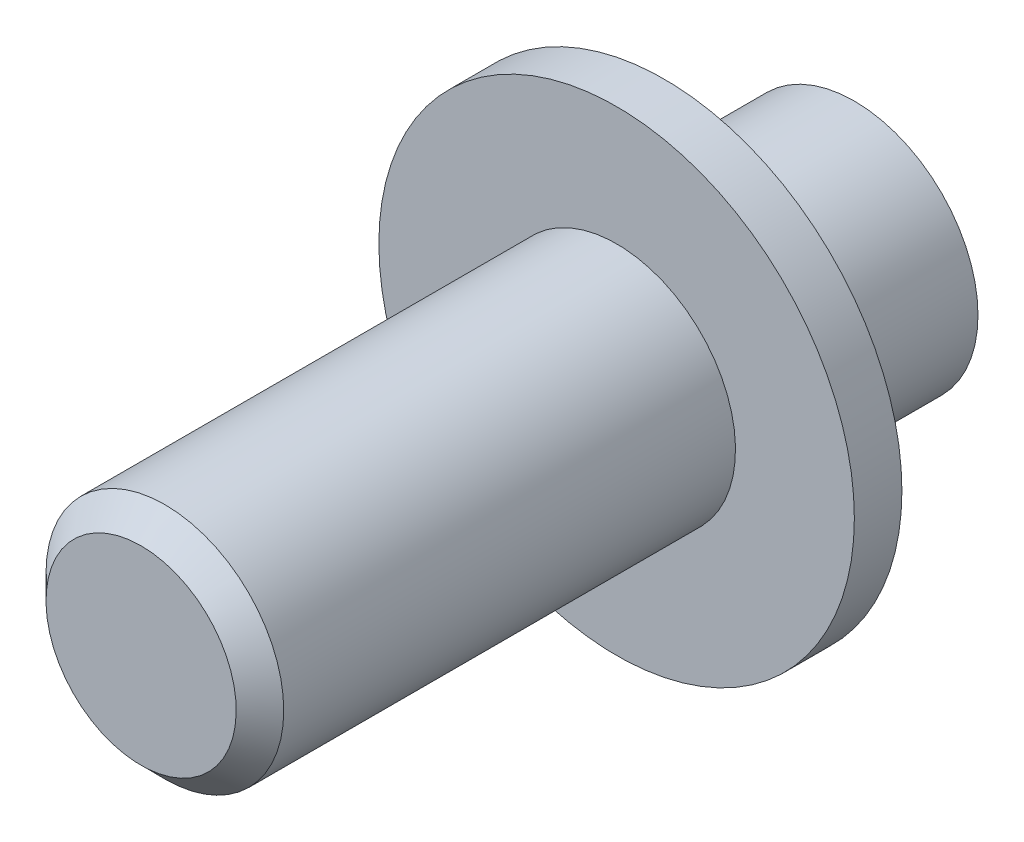
ISO-10303-21;
HEADER;
FILE_DESCRIPTION(('STEP AP214'),'2;1');
FILE_NAME('part.step','',(''),(''),'','','');
FILE_SCHEMA(('AUTOMOTIVE_DESIGN { 1 0 10303 214 1 1 1 1 }'));
ENDSEC;
DATA;
#1=APPLICATION_CONTEXT('core data for automotive mechanical design processes');
#2=APPLICATION_PROTOCOL_DEFINITION('international standard','automotive_design',2000,#1);
#3=PRODUCT_CONTEXT('',#1,'mechanical');
#4=PRODUCT('Part','Part','',(#3));
#5=PRODUCT_RELATED_PRODUCT_CATEGORY('part','',(#4));
#6=PRODUCT_DEFINITION_FORMATION('','',#4);
#7=PRODUCT_DEFINITION_CONTEXT('part definition',#1,'design');
#8=PRODUCT_DEFINITION('design','',#6,#7);
#9=PRODUCT_DEFINITION_SHAPE('','',#8);
#10=(LENGTH_UNIT() NAMED_UNIT(*) SI_UNIT(.MILLI.,.METRE.));
#11=(NAMED_UNIT(*) PLANE_ANGLE_UNIT() SI_UNIT($,.RADIAN.));
#12=(NAMED_UNIT(*) SI_UNIT($,.STERADIAN.) SOLID_ANGLE_UNIT());
#13=UNCERTAINTY_MEASURE_WITH_UNIT(LENGTH_MEASURE(1.E-05),#10,'distance_accuracy_value','');
#14=(GEOMETRIC_REPRESENTATION_CONTEXT(3) GLOBAL_UNCERTAINTY_ASSIGNED_CONTEXT((#13)) GLOBAL_UNIT_ASSIGNED_CONTEXT((#10,
#11,#12)) REPRESENTATION_CONTEXT('',''));
#15=CARTESIAN_POINT('',(0.,0.,0.));
#16=DIRECTION('',(0.,0.,1.));
#17=DIRECTION('',(1.,0.,0.));
#18=AXIS2_PLACEMENT_3D('',#15,#16,#17);
#19=CARTESIAN_POINT('',(-2.794,-2.794,13.97));
#20=DIRECTION('',(0.,0.,1.));
#21=DIRECTION('',(1.,0.,0.));
#22=AXIS2_PLACEMENT_3D('',#19,#20,#21);
#23=PLANE('',#22);
#24=CARTESIAN_POINT('',(0.,0.,13.97));
#25=DIRECTION('',(0.,0.,-1.));
#26=DIRECTION('',(0.,1.,0.));
#27=AXIS2_PLACEMENT_3D('',#24,#25,#26);
#28=CIRCLE('',#27,2.54);
#29=CARTESIAN_POINT('',(0.,2.54,13.97));
#30=VERTEX_POINT('',#29);
#31=EDGE_CURVE('E16',#30,#30,#28,.T.);
#32=ORIENTED_EDGE('',*,*,#31,.F.);
#33=EDGE_LOOP('',(#32));
#34=FACE_BOUND('',#33,.T.);
#35=ADVANCED_FACE('F13',(#34),#23,.T.);
#36=CARTESIAN_POINT('',(0.,0.,13.335));
#37=DIRECTION('',(0.,0.,-1.));
#38=DIRECTION('',(0.,1.,0.));
#39=AXIS2_PLACEMENT_3D('',#36,#37,#38);
#40=CONICAL_SURFACE('',#39,3.175,0.785398163397447);
#41=CARTESIAN_POINT('',(0.,0.,13.335));
#42=DIRECTION('',(0.,0.,1.));
#43=DIRECTION('',(-1.,0.,0.));
#44=AXIS2_PLACEMENT_3D('',#41,#42,#43);
#45=CIRCLE('',#44,3.175);
#46=CARTESIAN_POINT('',(-3.175,0.,13.335));
#47=VERTEX_POINT('',#46);
#48=EDGE_CURVE('E37',#47,#47,#45,.F.);
#49=ORIENTED_EDGE('',*,*,#48,.F.);
#50=EDGE_LOOP('',(#49));
#51=FACE_BOUND('',#50,.T.);
#52=ORIENTED_EDGE('',*,*,#31,.T.);
#53=EDGE_LOOP('',(#52));
#54=FACE_BOUND('',#53,.T.);
#55=ADVANCED_FACE('F46',(#51,#54),#40,.T.);
#56=CARTESIAN_POINT('',(0.,0.,13.335));
#57=DIRECTION('',(0.,0.,1.));
#58=DIRECTION('',(0.,-1.,0.));
#59=AXIS2_PLACEMENT_3D('',#56,#57,#58);
#60=CYLINDRICAL_SURFACE('',#59,3.175);
#61=ORIENTED_EDGE('',*,*,#48,.T.);
#62=EDGE_LOOP('',(#61));
#63=FACE_BOUND('',#62,.T.);
#64=CARTESIAN_POINT('',(0.,0.,1.27));
#65=DIRECTION('',(0.,0.,1.));
#66=DIRECTION('',(0.,-1.,0.));
#67=AXIS2_PLACEMENT_3D('',#64,#65,#66);
#68=CIRCLE('',#67,3.175);
#69=CARTESIAN_POINT('',(0.,-3.175,1.27));
#70=VERTEX_POINT('',#69);
#71=EDGE_CURVE('E35',#70,#70,#68,.F.);
#72=ORIENTED_EDGE('',*,*,#71,.F.);
#73=EDGE_LOOP('',(#72));
#74=FACE_BOUND('',#73,.T.);
#75=ADVANCED_FACE('F53',(#63,#74),#60,.T.);
#76=CARTESIAN_POINT('',(-6.985,-6.985,1.27));
#77=DIRECTION('',(0.,0.,1.));
#78=DIRECTION('',(1.,0.,0.));
#79=AXIS2_PLACEMENT_3D('',#76,#77,#78);
#80=PLANE('',#79);
#81=ORIENTED_EDGE('',*,*,#71,.T.);
#82=EDGE_LOOP('',(#81));
#83=FACE_BOUND('',#82,.T.);
#84=CARTESIAN_POINT('',(0.,0.,1.27));
#85=DIRECTION('',(0.,0.,1.));
#86=DIRECTION('',(1.,0.,0.));
#87=AXIS2_PLACEMENT_3D('',#84,#85,#86);
#88=CIRCLE('',#87,6.35);
#89=CARTESIAN_POINT('',(6.35,0.,1.27));
#90=VERTEX_POINT('',#89);
#91=EDGE_CURVE('E33',#90,#90,#88,.F.);
#92=ORIENTED_EDGE('',*,*,#91,.F.);
#93=EDGE_LOOP('',(#92));
#94=FACE_BOUND('',#93,.T.);
#95=ADVANCED_FACE('F73',(#83,#94),#80,.T.);
#96=CARTESIAN_POINT('',(0.,0.,1.27));
#97=DIRECTION('',(0.,0.,1.));
#98=DIRECTION('',(1.,0.,0.));
#99=AXIS2_PLACEMENT_3D('',#96,#97,#98);
#100=CYLINDRICAL_SURFACE('',#99,6.35);
#101=CARTESIAN_POINT('',(0.,0.,0.));
#102=DIRECTION('',(0.,0.,1.));
#103=DIRECTION('',(1.,0.,0.));
#104=AXIS2_PLACEMENT_3D('',#101,#102,#103);
#105=CIRCLE('',#104,6.35);
#106=CARTESIAN_POINT('',(6.35,0.,0.));
#107=VERTEX_POINT('',#106);
#108=EDGE_CURVE('E25',#107,#107,#105,.F.);
#109=ORIENTED_EDGE('',*,*,#108,.F.);
#110=EDGE_LOOP('',(#109));
#111=FACE_BOUND('',#110,.T.);
#112=ORIENTED_EDGE('',*,*,#91,.T.);
#113=EDGE_LOOP('',(#112));
#114=FACE_BOUND('',#113,.T.);
#115=ADVANCED_FACE('F69',(#111,#114),#100,.T.);
#116=CARTESIAN_POINT('',(3.6322,-3.6322,-5.08));
#117=DIRECTION('',(0.,0.,-1.));
#118=DIRECTION('',(-1.,0.,0.));
#119=AXIS2_PLACEMENT_3D('',#116,#117,#118);
#120=PLANE('',#119);
#121=CARTESIAN_POINT('',(0.,0.,-5.08));
#122=DIRECTION('',(0.,0.,-1.));
#123=DIRECTION('',(-1.,0.,0.));
#124=AXIS2_PLACEMENT_3D('',#121,#122,#123);
#125=CIRCLE('',#124,3.302);
#126=CARTESIAN_POINT('',(-3.302,0.,-5.08));
#127=VERTEX_POINT('',#126);
#128=EDGE_CURVE('E20',#127,#127,#125,.F.);
#129=ORIENTED_EDGE('',*,*,#128,.F.);
#130=EDGE_LOOP('',(#129));
#131=FACE_BOUND('',#130,.T.);
#132=ADVANCED_FACE('F62',(#131),#120,.T.);
#133=CARTESIAN_POINT('',(6.985,-6.985,0.));
#134=DIRECTION('',(0.,0.,-1.));
#135=DIRECTION('',(-1.,0.,0.));
#136=AXIS2_PLACEMENT_3D('',#133,#134,#135);
#137=PLANE('',#136);
#138=CARTESIAN_POINT('',(0.,0.,0.));
#139=DIRECTION('',(0.,0.,-1.));
#140=DIRECTION('',(-1.,0.,0.));
#141=AXIS2_PLACEMENT_3D('',#138,#139,#140);
#142=CIRCLE('',#141,3.302);
#143=CARTESIAN_POINT('',(-3.302,0.,0.));
#144=VERTEX_POINT('',#143);
#145=EDGE_CURVE('E9',#144,#144,#142,.T.);
#146=ORIENTED_EDGE('',*,*,#145,.F.);
#147=EDGE_LOOP('',(#146));
#148=FACE_BOUND('',#147,.T.);
#149=ORIENTED_EDGE('',*,*,#108,.T.);
#150=EDGE_LOOP('',(#149));
#151=FACE_BOUND('',#150,.T.);
#152=ADVANCED_FACE('F57',(#148,#151),#137,.T.);
#153=CARTESIAN_POINT('',(0.,0.,-5.08));
#154=DIRECTION('',(0.,0.,-1.));
#155=DIRECTION('',(-1.,0.,0.));
#156=AXIS2_PLACEMENT_3D('',#153,#154,#155);
#157=CYLINDRICAL_SURFACE('',#156,3.302);
#158=ORIENTED_EDGE('',*,*,#145,.T.);
#159=EDGE_LOOP('',(#158));
#160=FACE_BOUND('',#159,.T.);
#161=ORIENTED_EDGE('',*,*,#128,.T.);
#162=EDGE_LOOP('',(#161));
#163=FACE_BOUND('',#162,.T.);
#164=ADVANCED_FACE('F55',(#160,#163),#157,.T.);
#165=CLOSED_SHELL('',(#35,#55,#75,#95,#115,#132,#152,#164));
#166=MANIFOLD_SOLID_BREP('B1',#165);
#167=ADVANCED_BREP_SHAPE_REPRESENTATION('',(#18,#166),#14);
#168=SHAPE_DEFINITION_REPRESENTATION(#9,#167);
ENDSEC;
END-ISO-10303-21;
